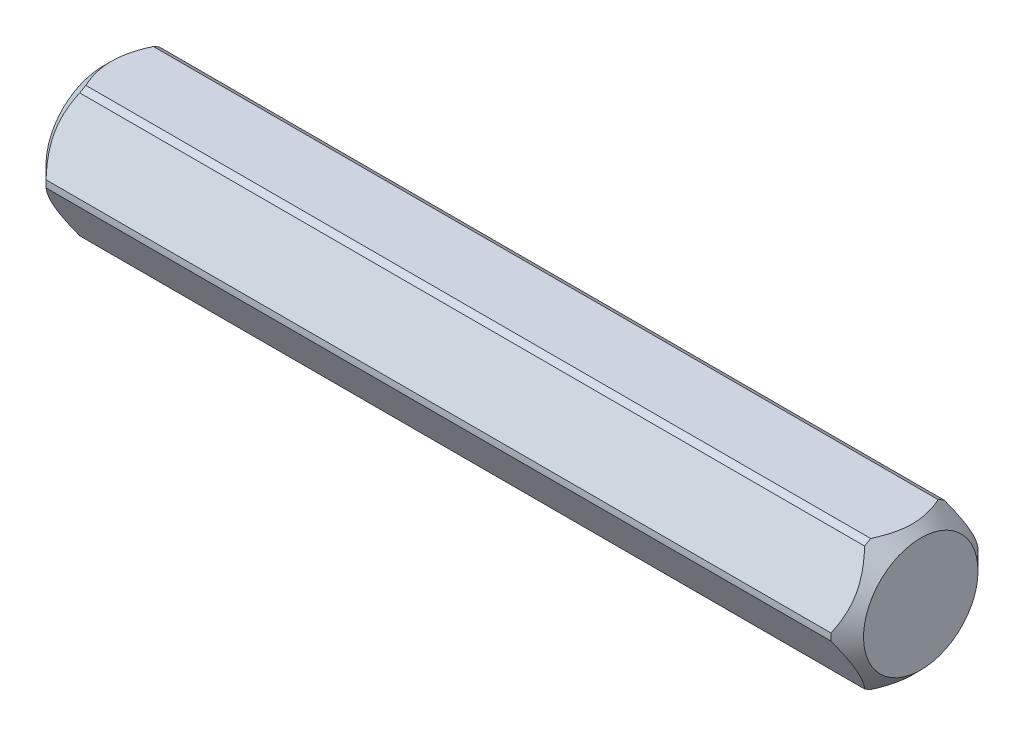
ISO-10303-21;
HEADER;
FILE_DESCRIPTION(('STEP AP214'),'2;1');
FILE_NAME('part.step','',(''),(''),'','','');
FILE_SCHEMA(('AUTOMOTIVE_DESIGN { 1 0 10303 214 1 1 1 1 }'));
ENDSEC;
DATA;
#1=APPLICATION_CONTEXT('core data for automotive mechanical design processes');
#2=APPLICATION_PROTOCOL_DEFINITION('international standard','automotive_design',2000,#1);
#3=PRODUCT_CONTEXT('',#1,'mechanical');
#4=PRODUCT('Part','Part','',(#3));
#5=PRODUCT_RELATED_PRODUCT_CATEGORY('part','',(#4));
#6=PRODUCT_DEFINITION_FORMATION('','',#4);
#7=PRODUCT_DEFINITION_CONTEXT('part definition',#1,'design');
#8=PRODUCT_DEFINITION('design','',#6,#7);
#9=PRODUCT_DEFINITION_SHAPE('','',#8);
#10=(LENGTH_UNIT() NAMED_UNIT(*) SI_UNIT(.MILLI.,.METRE.));
#11=(NAMED_UNIT(*) PLANE_ANGLE_UNIT() SI_UNIT($,.RADIAN.));
#12=(NAMED_UNIT(*) SI_UNIT($,.STERADIAN.) SOLID_ANGLE_UNIT());
#13=UNCERTAINTY_MEASURE_WITH_UNIT(LENGTH_MEASURE(1.E-05),#10,'distance_accuracy_value','');
#14=(GEOMETRIC_REPRESENTATION_CONTEXT(3) GLOBAL_UNCERTAINTY_ASSIGNED_CONTEXT((#13)) GLOBAL_UNIT_ASSIGNED_CONTEXT((#10,
#11,#12)) REPRESENTATION_CONTEXT('',''));
#15=CARTESIAN_POINT('',(0.,0.,0.));
#16=DIRECTION('',(0.,0.,1.));
#17=DIRECTION('',(1.,0.,0.));
#18=AXIS2_PLACEMENT_3D('',#15,#16,#17);
#19=CARTESIAN_POINT('',(-25.,0.,0.));
#20=DIRECTION('',(1.,0.,0.));
#21=DIRECTION('',(0.,0.,-1.));
#22=AXIS2_PLACEMENT_3D('',#19,#20,#21);
#23=CYLINDRICAL_SURFACE('',#22,4.5);
#24=CARTESIAN_POINT('',(-24.,0.,0.));
#25=DIRECTION('',(1.,0.,0.));
#26=DIRECTION('',(0.,0.,-1.));
#27=AXIS2_PLACEMENT_3D('',#24,#25,#26);
#28=CIRCLE('',#27,4.5);
#29=CARTESIAN_POINT('',(-24.,-3.99999999999999,-2.06155281280882));
#30=VERTEX_POINT('',#29);
#31=CARTESIAN_POINT('',(-24.,-3.7853571071357,-2.43332520873334));
#32=VERTEX_POINT('',#31);
#33=EDGE_CURVE('E440',#30,#32,#28,.T.);
#34=ORIENTED_EDGE('',*,*,#33,.T.);
#35=DIRECTION('',(1.,0.,0.));
#36=VECTOR('',#35,1.);
#37=CARTESIAN_POINT('',(-25.,-3.78535710713571,-2.43332520873334));
#38=LINE('',#37,#36);
#39=CARTESIAN_POINT('',(24.,-3.7853571071357,-2.43332520873334));
#40=VERTEX_POINT('',#39);
#41=EDGE_CURVE('E147',#32,#40,#38,.T.);
#42=ORIENTED_EDGE('',*,*,#41,.T.);
#43=CARTESIAN_POINT('',(24.,0.,0.));
#44=DIRECTION('',(1.,0.,0.));
#45=DIRECTION('',(0.,0.,-1.));
#46=AXIS2_PLACEMENT_3D('',#43,#44,#45);
#47=CIRCLE('',#46,4.5);
#48=CARTESIAN_POINT('',(24.,-3.99999999999999,-2.06155281280882));
#49=VERTEX_POINT('',#48);
#50=EDGE_CURVE('E129',#49,#40,#47,.T.);
#51=ORIENTED_EDGE('',*,*,#50,.F.);
#52=DIRECTION('',(1.,0.,0.));
#53=VECTOR('',#52,1.);
#54=CARTESIAN_POINT('',(-25.,-4.,-2.06155281280883));
#55=LINE('',#54,#53);
#56=EDGE_CURVE('E184',#49,#30,#55,.F.);
#57=ORIENTED_EDGE('',*,*,#56,.T.);
#58=EDGE_LOOP('',(#34,#42,#51,#57));
#59=FACE_BOUND('',#58,.T.);
#60=ADVANCED_FACE('F34',(#59),#23,.T.);
#61=CARTESIAN_POINT('',(-24.,-3.78535710713571,2.43332520873333));
#62=VERTEX_POINT('',#61);
#63=CARTESIAN_POINT('',(-24.,-4.,2.06155281280882));
#64=VERTEX_POINT('',#63);
#65=EDGE_CURVE('E441',#62,#64,#28,.T.);
#66=ORIENTED_EDGE('',*,*,#65,.T.);
#67=DIRECTION('',(1.,0.,0.));
#68=VECTOR('',#67,1.);
#69=CARTESIAN_POINT('',(-25.,-4.,2.06155281280882));
#70=LINE('',#69,#68);
#71=CARTESIAN_POINT('',(24.,-4.,2.06155281280882));
#72=VERTEX_POINT('',#71);
#73=EDGE_CURVE('E181',#64,#72,#70,.T.);
#74=ORIENTED_EDGE('',*,*,#73,.T.);
#75=CARTESIAN_POINT('',(24.,-3.78535710713571,2.43332520873333));
#76=VERTEX_POINT('',#75);
#77=EDGE_CURVE('E291',#76,#72,#47,.T.);
#78=ORIENTED_EDGE('',*,*,#77,.F.);
#79=DIRECTION('',(1.,0.,0.));
#80=VECTOR('',#79,1.);
#81=CARTESIAN_POINT('',(-25.,-3.78535710713572,2.43332520873334));
#82=LINE('',#81,#80);
#83=EDGE_CURVE('E178',#76,#62,#82,.F.);
#84=ORIENTED_EDGE('',*,*,#83,.T.);
#85=EDGE_LOOP('',(#66,#74,#78,#84));
#86=FACE_BOUND('',#85,.T.);
#87=ADVANCED_FACE('F313',(#86),#23,.T.);
#88=CARTESIAN_POINT('',(25.,-4.,2.3094010767585));
#89=DIRECTION('',(0.,1.,0.));
#90=DIRECTION('',(0.,0.,1.));
#91=AXIS2_PLACEMENT_3D('',#88,#89,#90);
#92=PLANE('',#91);
#93=ORIENTED_EDGE('',*,*,#73,.F.);
#94=CARTESIAN_POINT('',(-22.6928649035894,-4.,-4.20984774403587));
#95=CARTESIAN_POINT('',(-22.7683322571426,-4.,-4.10572300635099));
#96=CARTESIAN_POINT('',(-22.842955360482,-4.,-4.00097607923506));
#97=CARTESIAN_POINT('',(-22.9901526416945,-4.,-3.79001082425788));
#98=CARTESIAN_POINT('',(-23.0627262455371,-4.,-3.68379209634701));
#99=CARTESIAN_POINT('',(-23.2059640207921,-4.,-3.46890031935438));
#100=CARTESIAN_POINT('',(-23.2766094903172,-4.,-3.3602147530856));
#101=CARTESIAN_POINT('',(-23.4148896517596,-4.,-3.14095359873993));
#102=CARTESIAN_POINT('',(-23.482524567128,-4.,-3.03037815178072));
#103=CARTESIAN_POINT('',(-23.617180182585,-4.,-2.80193387204829));
#104=CARTESIAN_POINT('',(-23.6840300855366,-4.,-2.68396328072185));
#105=CARTESIAN_POINT('',(-23.8128070383945,-4.,-2.44537436143936));
#106=CARTESIAN_POINT('',(-23.8747334149841,-4.,-2.32475567421148));
#107=CARTESIAN_POINT('',(-24.0510992209669,-4.,-1.95915644375598));
#108=CARTESIAN_POINT('',(-24.1566367860336,-4.,-1.70959580749332));
#109=CARTESIAN_POINT('',(-24.2861804137903,-4.,-1.33029830953283));
#110=CARTESIAN_POINT('',(-24.3241322220595,-4.,-1.20530239351172));
#111=CARTESIAN_POINT('',(-24.3899388223468,-4.,-0.952617592005223));
#112=CARTESIAN_POINT('',(-24.4177928432461,-4.,-0.82492850164277));
#113=CARTESIAN_POINT('',(-24.4615756990499,-4.,-0.569582108969872));
#114=CARTESIAN_POINT('',(-24.4776869406595,-4.,-0.441956523226166));
#115=CARTESIAN_POINT('',(-24.4977250643249,-4.,-0.185747621111377));
#116=CARTESIAN_POINT('',(-24.5016533980343,-4.,-0.0571644206751577));
#117=CARTESIAN_POINT('',(-24.4971333329479,-4.,0.196534155188802));
#118=CARTESIAN_POINT('',(-24.4889943727592,-4.,0.321655254534303));
#119=CARTESIAN_POINT('',(-24.4613980492695,-4.,0.570635147563653));
#120=CARTESIAN_POINT('',(-24.4419394954324,-4.,0.694493807076179));
#121=CARTESIAN_POINT('',(-24.3923658437765,-4.,0.94214103598863));
#122=CARTESIAN_POINT('',(-24.3620813749865,-4.,1.06589520999821));
#123=CARTESIAN_POINT('',(-24.2923567428541,-4.,1.31074172841007));
#124=CARTESIAN_POINT('',(-24.2529177446344,-4.,1.43183440940288));
#125=CARTESIAN_POINT('',(-24.1588827297649,-4.,1.69187261628163));
#126=CARTESIAN_POINT('',(-24.1028455828701,-4.,1.83029292838178));
#127=CARTESIAN_POINT('',(-23.9823220956594,-4.,2.10343753165063));
#128=CARTESIAN_POINT('',(-23.9178315177234,-4.,2.23815992785214));
#129=CARTESIAN_POINT('',(-23.7819524607804,-4.,2.5046259823546));
#130=CARTESIAN_POINT('',(-23.7105414224703,-4.,2.63635804473518));
#131=CARTESIAN_POINT('',(-23.5624164043816,-4.,2.8967558561299));
#132=CARTESIAN_POINT('',(-23.4857033362368,-4.,3.02542212718707));
#133=CARTESIAN_POINT('',(-23.3320679810562,-4.,3.27361014613941));
#134=CARTESIAN_POINT('',(-23.2553567000029,-4.,3.39326320403362));
#135=CARTESIAN_POINT('',(-23.0988200514308,-4.,3.6305215763458));
#136=CARTESIAN_POINT('',(-23.0189944430863,-4.,3.74812673138176));
#137=CARTESIAN_POINT('',(-22.8574721996124,-4.,3.9805856203557));
#138=CARTESIAN_POINT('',(-22.7757967520329,-4.,4.09545412864817));
#139=CARTESIAN_POINT('',(-22.6103690712587,-4.,4.32363990413772));
#140=CARTESIAN_POINT('',(-22.5266174093983,-4.,4.4369575850589));
#141=CARTESIAN_POINT('',(-22.4420197526137,-4.,4.54962907034431));
#142=B_SPLINE_CURVE_WITH_KNOTS('',3,(#94,#95,#96,#97,#98,#99,#100,#101,#102,#103,#104,#105,#106,
#107,#108,#109,#110,#111,#112,#113,#114,#115,#116,#117,#118,#119,#120,#121,#122,#123,#124,#125,
#126,#127,#128,#129,#130,#131,#132,#133,#134,#135,#136,#137,#138,#139,#140,#141),.UNSPECIFIED.,
.F.,.F.,(4,2,2,2,2,2,2,2,2,2,2,2,2,2,2,2,2,2,2,2,2,2,2,4),(0.,0.385800042062576,
0.771707089606285,1.16054681927145,1.54935763997495,1.95602118677923,2.36274025152727,
3.17324409248812,3.56480527962874,3.95639636209754,4.34176689179921,4.72709150093877,
5.10270467711245,5.47835736547433,5.8601646545119,6.24192337648308,6.68956044955972,
7.13742278295022,7.5867975855516,8.036095313706,8.46243387400673,8.88880546795712,
9.31161701408834,9.734313474548),.UNSPECIFIED.);
#143=EDGE_CURVE('E212',#64,#30,#142,.F.);
#144=ORIENTED_EDGE('',*,*,#143,.T.);
#145=ORIENTED_EDGE('',*,*,#56,.F.);
#146=CARTESIAN_POINT('',(22.6928649035894,-4.,-4.20984774403588));
#147=CARTESIAN_POINT('',(22.7683322571427,-4.,-4.105723006351));
#148=CARTESIAN_POINT('',(22.842955360482,-4.,-4.00097607923507));
#149=CARTESIAN_POINT('',(22.9901526416945,-4.,-3.79001082425789));
#150=CARTESIAN_POINT('',(23.0627262455372,-4.,-3.68379209634702));
#151=CARTESIAN_POINT('',(23.2059640207921,-4.,-3.46890031935439));
#152=CARTESIAN_POINT('',(23.2766094903172,-4.,-3.36021475308561));
#153=CARTESIAN_POINT('',(23.4148896517596,-4.,-3.14095359873994));
#154=CARTESIAN_POINT('',(23.482524567128,-4.,-3.03037815178073));
#155=CARTESIAN_POINT('',(23.617180182585,-4.,-2.80193387204829));
#156=CARTESIAN_POINT('',(23.6840300855366,-4.,-2.68396328072186));
#157=CARTESIAN_POINT('',(23.8128070383945,-4.,-2.44537436143937));
#158=CARTESIAN_POINT('',(23.8747334149841,-4.,-2.32475567421148));
#159=CARTESIAN_POINT('',(24.0510992209669,-4.,-1.95915644375599));
#160=CARTESIAN_POINT('',(24.1566367860336,-4.,-1.70959580749332));
#161=CARTESIAN_POINT('',(24.2861804137904,-4.,-1.33029830953283));
#162=CARTESIAN_POINT('',(24.3241322220595,-4.,-1.20530239351172));
#163=CARTESIAN_POINT('',(24.3899388223468,-4.,-0.952617592005224));
#164=CARTESIAN_POINT('',(24.4177928432462,-4.,-0.82492850164277));
#165=CARTESIAN_POINT('',(24.4615756990499,-4.,-0.569582108969872));
#166=CARTESIAN_POINT('',(24.4776869406595,-4.,-0.441956523226166));
#167=CARTESIAN_POINT('',(24.4977250643249,-4.,-0.185747621111377));
#168=CARTESIAN_POINT('',(24.5016533980343,-4.,-0.057164420675157));
#169=CARTESIAN_POINT('',(24.4971333329479,-4.,0.196534155188803));
#170=CARTESIAN_POINT('',(24.4889943727592,-4.,0.321655254534304));
#171=CARTESIAN_POINT('',(24.4613980492696,-4.,0.570635147563655));
#172=CARTESIAN_POINT('',(24.4419394954324,-4.,0.694493807076181));
#173=CARTESIAN_POINT('',(24.3923658437765,-4.,0.942141035988633));
#174=CARTESIAN_POINT('',(24.3620813749865,-4.,1.06589520999821));
#175=CARTESIAN_POINT('',(24.2923567428542,-4.,1.31074172841007));
#176=CARTESIAN_POINT('',(24.2529177446344,-4.,1.43183440940289));
#177=CARTESIAN_POINT('',(24.1588827297649,-4.,1.69187261628163));
#178=CARTESIAN_POINT('',(24.1028455828701,-4.,1.83029292838179));
#179=CARTESIAN_POINT('',(23.9823220956594,-4.,2.10343753165063));
#180=CARTESIAN_POINT('',(23.9178315177234,-4.,2.23815992785214));
#181=CARTESIAN_POINT('',(23.7819524607804,-4.,2.50462598235461));
#182=CARTESIAN_POINT('',(23.7105414224704,-4.,2.63635804473519));
#183=CARTESIAN_POINT('',(23.5624164043816,-4.,2.89675585612991));
#184=CARTESIAN_POINT('',(23.4857033362368,-4.,3.02542212718708));
#185=CARTESIAN_POINT('',(23.3320679810562,-4.,3.27361014613942));
#186=CARTESIAN_POINT('',(23.2553567000029,-4.,3.39326320403363));
#187=CARTESIAN_POINT('',(23.0988200514308,-4.,3.63052157634581));
#188=CARTESIAN_POINT('',(23.0189944430863,-4.,3.74812673138178));
#189=CARTESIAN_POINT('',(22.8574721996124,-4.,3.98058562035571));
#190=CARTESIAN_POINT('',(22.7757967520329,-4.,4.09545412864819));
#191=CARTESIAN_POINT('',(22.6103690712587,-4.,4.32363990413774));
#192=CARTESIAN_POINT('',(22.5266174093983,-4.,4.43695758505892));
#193=CARTESIAN_POINT('',(22.4420197526137,-4.,4.54962907034433));
#194=B_SPLINE_CURVE_WITH_KNOTS('',3,(#146,#147,#148,#149,#150,#151,#152,#153,#154,#155,#156,
#157,#158,#159,#160,#161,#162,#163,#164,#165,#166,#167,#168,#169,#170,#171,#172,#173,#174,#175,
#176,#177,#178,#179,#180,#181,#182,#183,#184,#185,#186,#187,#188,#189,#190,#191,#192,#193),
.UNSPECIFIED.,.F.,.F.,(4,2,2,2,2,2,2,2,2,2,2,2,2,2,2,2,2,2,2,2,2,2,2,4),(0.,0.385800042062574,
0.771707089606282,1.16054681927145,1.54935763997495,1.95602118677923,2.36274025152728,
3.17324409248813,3.56480527962875,3.95639636209755,4.34176689179922,4.72709150093878,
5.10270467711246,5.47835736547434,5.86016465451192,6.2419233764831,6.68956044955974,
7.13742278295024,7.58679758555162,8.03609531370602,8.46243387400676,8.88880546795715,
9.31161701408837,9.73431347454803),.UNSPECIFIED.);
#195=EDGE_CURVE('E297',#49,#72,#194,.T.);
#196=ORIENTED_EDGE('',*,*,#195,.T.);
#197=EDGE_LOOP('',(#93,#144,#145,#196));
#198=FACE_BOUND('',#197,.T.);
#199=ADVANCED_FACE('F309',(#198),#92,.F.);
#200=CARTESIAN_POINT('',(-24.,0.214642892864282,4.49487802154217));
#201=VERTEX_POINT('',#200);
#202=CARTESIAN_POINT('',(-24.,-0.214642892864288,4.49487802154217));
#203=VERTEX_POINT('',#202);
#204=EDGE_CURVE('E288',#201,#203,#28,.T.);
#205=ORIENTED_EDGE('',*,*,#204,.T.);
#206=DIRECTION('',(1.,0.,0.));
#207=VECTOR('',#206,1.);
#208=CARTESIAN_POINT('',(-25.,-0.214642892864287,4.49487802154217));
#209=LINE('',#208,#207);
#210=CARTESIAN_POINT('',(24.,-0.214642892864288,4.49487802154217));
#211=VERTEX_POINT('',#210);
#212=EDGE_CURVE('E175',#203,#211,#209,.T.);
#213=ORIENTED_EDGE('',*,*,#212,.T.);
#214=CARTESIAN_POINT('',(24.,0.214642892864282,4.49487802154217));
#215=VERTEX_POINT('',#214);
#216=EDGE_CURVE('E289',#215,#211,#47,.T.);
#217=ORIENTED_EDGE('',*,*,#216,.F.);
#218=DIRECTION('',(1.,0.,0.));
#219=VECTOR('',#218,1.);
#220=CARTESIAN_POINT('',(-25.,0.214642892864283,4.49487802154217));
#221=LINE('',#220,#219);
#222=EDGE_CURVE('E172',#215,#201,#221,.F.);
#223=ORIENTED_EDGE('',*,*,#222,.T.);
#224=EDGE_LOOP('',(#205,#213,#217,#223));
#225=FACE_BOUND('',#224,.T.);
#226=ADVANCED_FACE('F287',(#225),#23,.T.);
#227=CARTESIAN_POINT('',(25.,0.,4.618802153517));
#228=DIRECTION('',(0.,0.5,-0.866025403784438));
#229=DIRECTION('',(0.,0.866025403784439,0.5));
#230=AXIS2_PLACEMENT_3D('',#227,#228,#229);
#231=PLANE('',#230);
#232=ORIENTED_EDGE('',*,*,#212,.F.);
#233=CARTESIAN_POINT('',(-23.9998941963782,-0.214442892864289,4.49499349159601));
#234=CARTESIAN_POINT('',(-24.0664192825533,-0.340235442402056,4.42236712925833));
#235=CARTESIAN_POINT('',(-24.1284859139684,-0.468005378985892,4.34859912197731));
#236=CARTESIAN_POINT('',(-24.2410974501275,-0.727878171317941,4.19856149536934));
#237=CARTESIAN_POINT('',(-24.2915930288924,-0.859996928098182,4.12228269557727));
#238=CARTESIAN_POINT('',(-24.3772964035166,-1.12616188041506,3.96861228870828));
#239=CARTESIAN_POINT('',(-24.412692978064,-1.26016123783863,3.89124772362854));
#240=CARTESIAN_POINT('',(-24.4663535308738,-1.53053549616594,3.73514707280132));
#241=CARTESIAN_POINT('',(-24.4846469548417,-1.66690590097512,3.65641358287524));
#242=CARTESIAN_POINT('',(-24.5018229694782,-1.92984243616877,3.5046071035014));
#243=CARTESIAN_POINT('',(-24.5021148581694,-2.05633906156165,3.43157424277924));
#244=CARTESIAN_POINT('',(-24.4867907591089,-2.30866082335366,3.28589620568623));
#245=CARTESIAN_POINT('',(-24.4711663583711,-2.43448556925573,3.21325125476895));
#246=CARTESIAN_POINT('',(-24.4252415067076,-2.68406443764097,3.06915682792269));
#247=CARTESIAN_POINT('',(-24.3949407378895,-2.80781851521306,2.99770737792313));
#248=CARTESIAN_POINT('',(-24.3216820791155,-3.05249145481317,2.85644539038159));
#249=CARTESIAN_POINT('',(-24.2787190677523,-3.17340914822362,2.78663352754128));
#250=CARTESIAN_POINT('',(-24.1967021799686,-3.3765763870683,2.66933486750379));
#251=CARTESIAN_POINT('',(-24.160279052702,-3.459641216358,2.62137736595319));
#252=CARTESIAN_POINT('',(-24.0831422190421,-3.62390438606655,2.52653998070401));
#253=CARTESIAN_POINT('',(-24.0424451392451,-3.70510856445355,2.47965672645296));
#254=CARTESIAN_POINT('',(-23.9998941963782,-3.78555710713571,2.4332097386795));
#255=B_SPLINE_CURVE_WITH_KNOTS('',3,(#233,#234,#235,#236,#237,#238,#239,#240,#241,#242,#243,
#244,#245,#246,#247,#248,#249,#250,#251,#252,#253,#254),.UNSPECIFIED.,.F.,.F.,(4,2,2,2,2,2,2,2,
2,2,4),(0.,0.479542803803611,0.961093310814039,1.43643287483049,1.91095255343955,
2.34827188801426,2.78582249958598,3.22338258899905,3.66111989867402,3.96880795536116,
4.27534051498786),.UNSPECIFIED.);
#256=EDGE_CURVE('E222',#203,#62,#255,.T.);
#257=ORIENTED_EDGE('',*,*,#256,.T.);
#258=ORIENTED_EDGE('',*,*,#83,.F.);
#259=CARTESIAN_POINT('',(23.9998941963782,-3.78555710713571,2.4332097386795));
#260=CARTESIAN_POINT('',(24.0664192825533,-3.65976455759794,2.50583610101718));
#261=CARTESIAN_POINT('',(24.1284859139684,-3.53199462101411,2.5796041082982));
#262=CARTESIAN_POINT('',(24.2410974501275,-3.27212182868206,2.72964173490617));
#263=CARTESIAN_POINT('',(24.2915930288924,-3.14000307190182,2.80592053469824));
#264=CARTESIAN_POINT('',(24.3772964035166,-2.87383811958494,2.95959094156723));
#265=CARTESIAN_POINT('',(24.412692978064,-2.73983876216137,3.03695550664697));
#266=CARTESIAN_POINT('',(24.4663535308738,-2.46946450383406,3.19305615747419));
#267=CARTESIAN_POINT('',(24.4846469548417,-2.33309409902487,3.27178964740027));
#268=CARTESIAN_POINT('',(24.5018229694783,-2.07015756383122,3.42359612677411));
#269=CARTESIAN_POINT('',(24.5021148581694,-1.94366093843834,3.49662898749627));
#270=CARTESIAN_POINT('',(24.4867907591089,-1.69133917664633,3.64230702458928));
#271=CARTESIAN_POINT('',(24.4711663583711,-1.56551443074426,3.71495197550656));
#272=CARTESIAN_POINT('',(24.4252415067076,-1.31593556235902,3.85904640235282));
#273=CARTESIAN_POINT('',(24.3949407378895,-1.19218148478693,3.93049585235238));
#274=CARTESIAN_POINT('',(24.3216820791155,-0.947508545186819,4.07175783989393));
#275=CARTESIAN_POINT('',(24.2787190677524,-0.826590851776376,4.14156970273423));
#276=CARTESIAN_POINT('',(24.1967021799686,-0.623423612931689,4.25886836277173));
#277=CARTESIAN_POINT('',(24.160279052702,-0.540358783641999,4.30682586432232));
#278=CARTESIAN_POINT('',(24.0831422190421,-0.376095613933444,4.40166324957149));
#279=CARTESIAN_POINT('',(24.0424451392451,-0.294891435546448,4.44854650382255));
#280=CARTESIAN_POINT('',(23.9998941963782,-0.214442892864288,4.49499349159601));
#281=B_SPLINE_CURVE_WITH_KNOTS('',3,(#259,#260,#261,#262,#263,#264,#265,#266,#267,#268,#269,
#270,#271,#272,#273,#274,#275,#276,#277,#278,#279,#280),.UNSPECIFIED.,.F.,.F.,(4,2,2,2,2,2,2,2,
2,2,4),(0.,0.479542803803614,0.961093310814044,1.4364328748305,1.91095255343956,
2.34827188801427,2.78582249958599,3.22338258899906,3.66111989867404,3.96880795536116,
4.27534051498786),.UNSPECIFIED.);
#282=EDGE_CURVE('E304',#76,#211,#281,.T.);
#283=ORIENTED_EDGE('',*,*,#282,.T.);
#284=EDGE_LOOP('',(#232,#257,#258,#283));
#285=FACE_BOUND('',#284,.T.);
#286=ADVANCED_FACE('F315',(#285),#231,.F.);
#287=CARTESIAN_POINT('',(-24.,4.,2.06155281280883));
#288=VERTEX_POINT('',#287);
#289=CARTESIAN_POINT('',(-24.,3.78535710713571,2.43332520873334));
#290=VERTEX_POINT('',#289);
#291=EDGE_CURVE('E298',#288,#290,#28,.T.);
#292=ORIENTED_EDGE('',*,*,#291,.T.);
#293=DIRECTION('',(1.,0.,0.));
#294=VECTOR('',#293,1.);
#295=CARTESIAN_POINT('',(-25.,3.78535710713571,2.43332520873334));
#296=LINE('',#295,#294);
#297=CARTESIAN_POINT('',(24.,3.78535710713571,2.43332520873334));
#298=VERTEX_POINT('',#297);
#299=EDGE_CURVE('E167',#290,#298,#296,.T.);
#300=ORIENTED_EDGE('',*,*,#299,.T.);
#301=CARTESIAN_POINT('',(24.,4.,2.06155281280883));
#302=VERTEX_POINT('',#301);
#303=EDGE_CURVE('E131',#302,#298,#47,.T.);
#304=ORIENTED_EDGE('',*,*,#303,.F.);
#305=DIRECTION('',(1.,0.,0.));
#306=VECTOR('',#305,1.);
#307=CARTESIAN_POINT('',(-25.,4.,2.06155281280883));
#308=LINE('',#307,#306);
#309=EDGE_CURVE('E163',#302,#288,#308,.F.);
#310=ORIENTED_EDGE('',*,*,#309,.T.);
#311=EDGE_LOOP('',(#292,#300,#304,#310));
#312=FACE_BOUND('',#311,.T.);
#313=ADVANCED_FACE('F319',(#312),#23,.T.);
#314=CARTESIAN_POINT('',(25.,4.,2.3094010767585));
#315=DIRECTION('',(0.,-0.499999999999999,-0.866025403784439));
#316=DIRECTION('',(0.,0.866025403784439,-0.499999999999999));
#317=AXIS2_PLACEMENT_3D('',#314,#315,#316);
#318=PLANE('',#317);
#319=ORIENTED_EDGE('',*,*,#299,.F.);
#320=CARTESIAN_POINT('',(-23.9998941963782,3.78555710713571,2.4332097386795));
#321=CARTESIAN_POINT('',(-24.0664192825533,3.65976455759794,2.50583610101718));
#322=CARTESIAN_POINT('',(-24.1284859139684,3.53199462101411,2.5796041082982));
#323=CARTESIAN_POINT('',(-24.2410974501275,3.27212182868206,2.72964173490617));
#324=CARTESIAN_POINT('',(-24.2915930288924,3.14000307190182,2.80592053469824));
#325=CARTESIAN_POINT('',(-24.3772964035166,2.87383811958494,2.95959094156723));
#326=CARTESIAN_POINT('',(-24.412692978064,2.73983876216137,3.03695550664697));
#327=CARTESIAN_POINT('',(-24.4663535308738,2.46946450383406,3.19305615747419));
#328=CARTESIAN_POINT('',(-24.4846469548417,2.33309409902488,3.27178964740027));
#329=CARTESIAN_POINT('',(-24.5018229694782,2.07015756383123,3.42359612677411));
#330=CARTESIAN_POINT('',(-24.5021148581694,1.94366093843834,3.49662898749627));
#331=CARTESIAN_POINT('',(-24.4867907591089,1.69133917664634,3.64230702458928));
#332=CARTESIAN_POINT('',(-24.4711663583711,1.56551443074427,3.71495197550656));
#333=CARTESIAN_POINT('',(-24.4252415067076,1.31593556235903,3.85904640235282));
#334=CARTESIAN_POINT('',(-24.3949407378895,1.19218148478694,3.93049585235238));
#335=CARTESIAN_POINT('',(-24.3216820791155,0.947508545186824,4.07175783989392));
#336=CARTESIAN_POINT('',(-24.2787190677524,0.826590851776383,4.14156970273423));
#337=CARTESIAN_POINT('',(-24.1967021799686,0.623423612931694,4.25886836277172));
#338=CARTESIAN_POINT('',(-24.160279052702,0.540358783642001,4.30682586432231));
#339=CARTESIAN_POINT('',(-24.0831422190421,0.376095613933442,4.40166324957149));
#340=CARTESIAN_POINT('',(-24.0424451392451,0.294891435546444,4.44854650382255));
#341=CARTESIAN_POINT('',(-23.9998941963782,0.214442892864283,4.49499349159601));
#342=B_SPLINE_CURVE_WITH_KNOTS('',3,(#320,#321,#322,#323,#324,#325,#326,#327,#328,#329,#330,
#331,#332,#333,#334,#335,#336,#337,#338,#339,#340,#341),.UNSPECIFIED.,.F.,.F.,(4,2,2,2,2,2,2,2,
2,2,4),(0.,0.479542803803611,0.961093310814039,1.43643287483049,1.91095255343955,
2.34827188801426,2.78582249958598,3.22338258899905,3.66111989867402,3.96880795536116,
4.27534051498786),.UNSPECIFIED.);
#343=EDGE_CURVE('E230',#290,#201,#342,.T.);
#344=ORIENTED_EDGE('',*,*,#343,.T.);
#345=ORIENTED_EDGE('',*,*,#222,.F.);
#346=CARTESIAN_POINT('',(23.9998941963782,0.214442892864283,4.49499349159601));
#347=CARTESIAN_POINT('',(24.0664192825533,0.340235442402051,4.42236712925833));
#348=CARTESIAN_POINT('',(24.1284859139684,0.468005378985888,4.34859912197731));
#349=CARTESIAN_POINT('',(24.2410974501276,0.727878171317938,4.19856149536934));
#350=CARTESIAN_POINT('',(24.2915930288924,0.859996928098178,4.12228269557727));
#351=CARTESIAN_POINT('',(24.3772964035166,1.12616188041506,3.96861228870828));
#352=CARTESIAN_POINT('',(24.4126929780641,1.26016123783863,3.89124772362854));
#353=CARTESIAN_POINT('',(24.4663535308738,1.53053549616594,3.73514707280132));
#354=CARTESIAN_POINT('',(24.4846469548417,1.66690590097513,3.65641358287524));
#355=CARTESIAN_POINT('',(24.5018229694783,1.92984243616878,3.5046071035014));
#356=CARTESIAN_POINT('',(24.5021148581694,2.05633906156166,3.43157424277924));
#357=CARTESIAN_POINT('',(24.486790759109,2.30866082335366,3.28589620568622));
#358=CARTESIAN_POINT('',(24.4711663583711,2.43448556925574,3.21325125476895));
#359=CARTESIAN_POINT('',(24.4252415067076,2.68406443764098,3.06915682792269));
#360=CARTESIAN_POINT('',(24.3949407378895,2.80781851521307,2.99770737792313));
#361=CARTESIAN_POINT('',(24.3216820791155,3.05249145481318,2.85644539038158));
#362=CARTESIAN_POINT('',(24.2787190677524,3.17340914822362,2.78663352754128));
#363=CARTESIAN_POINT('',(24.1967021799686,3.37657638706831,2.66933486750378));
#364=CARTESIAN_POINT('',(24.160279052702,3.459641216358,2.62137736595319));
#365=CARTESIAN_POINT('',(24.0831422190421,3.62390438606655,2.52653998070402));
#366=CARTESIAN_POINT('',(24.0424451392451,3.70510856445355,2.47965672645296));
#367=CARTESIAN_POINT('',(23.9998941963782,3.78555710713571,2.4332097386795));
#368=B_SPLINE_CURVE_WITH_KNOTS('',3,(#346,#347,#348,#349,#350,#351,#352,#353,#354,#355,#356,
#357,#358,#359,#360,#361,#362,#363,#364,#365,#366,#367),.UNSPECIFIED.,.F.,.F.,(4,2,2,2,2,2,2,2,
2,2,4),(0.,0.479542803803613,0.961093310814043,1.4364328748305,1.91095255343956,
2.34827188801427,2.78582249958599,3.22338258899906,3.66111989867404,3.96880795536116,
4.27534051498786),.UNSPECIFIED.);
#369=EDGE_CURVE('E164',#215,#298,#368,.T.);
#370=ORIENTED_EDGE('',*,*,#369,.T.);
#371=EDGE_LOOP('',(#319,#344,#345,#370));
#372=FACE_BOUND('',#371,.T.);
#373=ADVANCED_FACE('F243',(#372),#318,.F.);
#374=CARTESIAN_POINT('',(-24.,0.,0.));
#375=DIRECTION('',(1.,0.,0.));
#376=DIRECTION('',(0.,0.,-1.));
#377=AXIS2_PLACEMENT_3D('',#374,#375,#376);
#378=CIRCLE('',#377,4.5);
#379=CARTESIAN_POINT('',(-24.,4.,-2.06155281280883));
#380=VERTEX_POINT('',#379);
#381=CARTESIAN_POINT('',(-24.,3.78535710713571,-2.43332520873334));
#382=VERTEX_POINT('',#381);
#383=EDGE_CURVE('E11',#380,#382,#378,.F.);
#384=ORIENTED_EDGE('',*,*,#383,.F.);
#385=DIRECTION('',(1.,0.,0.));
#386=VECTOR('',#385,1.);
#387=CARTESIAN_POINT('',(-25.,4.,-2.06155281280883));
#388=LINE('',#387,#386);
#389=CARTESIAN_POINT('',(24.,4.,-2.06155281280883));
#390=VERTEX_POINT('',#389);
#391=EDGE_CURVE('E149',#380,#390,#388,.T.);
#392=ORIENTED_EDGE('',*,*,#391,.T.);
#393=CARTESIAN_POINT('',(24.,0.,0.));
#394=DIRECTION('',(-1.,0.,0.));
#395=DIRECTION('',(0.,0.,1.));
#396=AXIS2_PLACEMENT_3D('',#393,#394,#395);
#397=CIRCLE('',#396,4.5);
#398=CARTESIAN_POINT('',(24.,3.78535710713571,-2.43332520873334));
#399=VERTEX_POINT('',#398);
#400=EDGE_CURVE('E43',#399,#390,#397,.F.);
#401=ORIENTED_EDGE('',*,*,#400,.F.);
#402=DIRECTION('',(1.,0.,0.));
#403=VECTOR('',#402,1.);
#404=CARTESIAN_POINT('',(-25.,3.78535710713571,-2.43332520873334));
#405=LINE('',#404,#403);
#406=EDGE_CURVE('E139',#399,#382,#405,.F.);
#407=ORIENTED_EDGE('',*,*,#406,.T.);
#408=EDGE_LOOP('',(#384,#392,#401,#407));
#409=FACE_BOUND('',#408,.T.);
#410=ADVANCED_FACE('F166',(#409),#23,.T.);
#411=CARTESIAN_POINT('',(25.,4.,-2.3094010767585));
#412=DIRECTION('',(0.,-1.,0.));
#413=DIRECTION('',(0.,0.,-1.));
#414=AXIS2_PLACEMENT_3D('',#411,#412,#413);
#415=PLANE('',#414);
#416=ORIENTED_EDGE('',*,*,#391,.F.);
#417=CARTESIAN_POINT('',(-22.6928649035894,4.,-4.20984774403589));
#418=CARTESIAN_POINT('',(-22.7683322571426,4.,-4.105723006351));
#419=CARTESIAN_POINT('',(-22.842955360482,4.,-4.00097607923508));
#420=CARTESIAN_POINT('',(-22.9901526416945,4.,-3.79001082425789));
#421=CARTESIAN_POINT('',(-23.0627262455371,4.,-3.68379209634702));
#422=CARTESIAN_POINT('',(-23.2059640207921,4.,-3.46890031935439));
#423=CARTESIAN_POINT('',(-23.2766094903172,4.,-3.36021475308561));
#424=CARTESIAN_POINT('',(-23.4148896517596,4.,-3.14095359873994));
#425=CARTESIAN_POINT('',(-23.482524567128,4.,-3.03037815178073));
#426=CARTESIAN_POINT('',(-23.617180182585,4.,-2.8019338720483));
#427=CARTESIAN_POINT('',(-23.6840300855366,4.,-2.68396328072186));
#428=CARTESIAN_POINT('',(-23.8128070383945,4.,-2.44537436143937));
#429=CARTESIAN_POINT('',(-23.8747334149841,4.,-2.32475567421148));
#430=CARTESIAN_POINT('',(-24.0510992209669,4.,-1.95915644375599));
#431=CARTESIAN_POINT('',(-24.1566367860336,4.,-1.70959580749333));
#432=CARTESIAN_POINT('',(-24.2861804137904,4.,-1.33029830953283));
#433=CARTESIAN_POINT('',(-24.3241322220595,4.,-1.20530239351173));
#434=CARTESIAN_POINT('',(-24.3899388223468,4.,-0.952617592005226));
#435=CARTESIAN_POINT('',(-24.4177928432462,4.,-0.824928501642774));
#436=CARTESIAN_POINT('',(-24.4615756990499,4.,-0.569582108969876));
#437=CARTESIAN_POINT('',(-24.4776869406595,4.,-0.44195652322617));
#438=CARTESIAN_POINT('',(-24.4977250643249,4.,-0.185747621111382));
#439=CARTESIAN_POINT('',(-24.5016533980343,4.,-0.0571644206751632));
#440=CARTESIAN_POINT('',(-24.4971333329479,4.,0.196534155188796));
#441=CARTESIAN_POINT('',(-24.4889943727592,4.,0.321655254534297));
#442=CARTESIAN_POINT('',(-24.4613980492696,4.,0.570635147563647));
#443=CARTESIAN_POINT('',(-24.4419394954324,4.,0.694493807076172));
#444=CARTESIAN_POINT('',(-24.3923658437765,4.,0.942141035988623));
#445=CARTESIAN_POINT('',(-24.3620813749865,4.,1.0658952099982));
#446=CARTESIAN_POINT('',(-24.2923567428542,4.,1.31074172841006));
#447=CARTESIAN_POINT('',(-24.2529177446344,4.,1.43183440940287));
#448=CARTESIAN_POINT('',(-24.1588827297649,4.,1.69187261628162));
#449=CARTESIAN_POINT('',(-24.1028455828701,4.,1.83029292838177));
#450=CARTESIAN_POINT('',(-23.9823220956594,4.,2.10343753165062));
#451=CARTESIAN_POINT('',(-23.9178315177234,4.,2.23815992785212));
#452=CARTESIAN_POINT('',(-23.7819524607804,4.,2.50462598235459));
#453=CARTESIAN_POINT('',(-23.7105414224704,4.,2.63635804473517));
#454=CARTESIAN_POINT('',(-23.5624164043816,4.,2.89675585612988));
#455=CARTESIAN_POINT('',(-23.4857033362368,4.,3.02542212718705));
#456=CARTESIAN_POINT('',(-23.3320679810562,4.,3.27361014613939));
#457=CARTESIAN_POINT('',(-23.2553567000029,4.,3.3932632040336));
#458=CARTESIAN_POINT('',(-23.0988200514308,4.,3.63052157634578));
#459=CARTESIAN_POINT('',(-23.0189944430863,4.,3.74812673138174));
#460=CARTESIAN_POINT('',(-22.8574721996124,4.,3.98058562035568));
#461=CARTESIAN_POINT('',(-22.7757967520329,4.,4.09545412864815));
#462=CARTESIAN_POINT('',(-22.6103690712587,4.,4.3236399041377));
#463=CARTESIAN_POINT('',(-22.5266174093984,4.,4.43695758505888));
#464=CARTESIAN_POINT('',(-22.4420197526138,4.,4.54962907034429));
#465=B_SPLINE_CURVE_WITH_KNOTS('',3,(#417,#418,#419,#420,#421,#422,#423,#424,#425,#426,#427,
#428,#429,#430,#431,#432,#433,#434,#435,#436,#437,#438,#439,#440,#441,#442,#443,#444,#445,#446,
#447,#448,#449,#450,#451,#452,#453,#454,#455,#456,#457,#458,#459,#460,#461,#462,#463,#464),
.UNSPECIFIED.,.F.,.F.,(4,2,2,2,2,2,2,2,2,2,2,2,2,2,2,2,2,2,2,2,2,2,2,4),(0.,0.385800042062577,
0.771707089606284,1.16054681927146,1.54935763997496,1.95602118677923,2.36274025152728,
3.17324409248814,3.56480527962875,3.95639636209756,4.34176689179922,4.72709150093878,
5.10270467711246,5.47835736547434,5.86016465451191,6.24192337648309,6.68956044955973,
7.13742278295023,7.5867975855516,8.036095313706,8.46243387400673,8.88880546795712,
9.31161701408833,9.73431347454799),.UNSPECIFIED.);
#466=EDGE_CURVE('E49',#380,#288,#465,.T.);
#467=ORIENTED_EDGE('',*,*,#466,.T.);
#468=ORIENTED_EDGE('',*,*,#309,.F.);
#469=CARTESIAN_POINT('',(22.6928649035894,4.,-4.2098477440359));
#470=CARTESIAN_POINT('',(22.7683322571427,4.,-4.10572300635101));
#471=CARTESIAN_POINT('',(22.842955360482,4.,-4.00097607923509));
#472=CARTESIAN_POINT('',(22.9901526416945,4.,-3.7900108242579));
#473=CARTESIAN_POINT('',(23.0627262455372,4.,-3.68379209634703));
#474=CARTESIAN_POINT('',(23.2059640207921,4.,-3.4689003193544));
#475=CARTESIAN_POINT('',(23.2766094903172,4.,-3.36021475308562));
#476=CARTESIAN_POINT('',(23.4148896517596,4.,-3.14095359873995));
#477=CARTESIAN_POINT('',(23.482524567128,4.,-3.03037815178074));
#478=CARTESIAN_POINT('',(23.617180182585,4.,-2.80193387204831));
#479=CARTESIAN_POINT('',(23.6840300855366,4.,-2.68396328072187));
#480=CARTESIAN_POINT('',(23.8128070383945,4.,-2.44537436143938));
#481=CARTESIAN_POINT('',(23.8747334149841,4.,-2.32475567421149));
#482=CARTESIAN_POINT('',(24.0510992209669,4.,-1.95915644375599));
#483=CARTESIAN_POINT('',(24.1566367860336,4.,-1.70959580749333));
#484=CARTESIAN_POINT('',(24.2861804137904,4.,-1.33029830953283));
#485=CARTESIAN_POINT('',(24.3241322220595,4.,-1.20530239351173));
#486=CARTESIAN_POINT('',(24.3899388223468,4.,-0.952617592005227));
#487=CARTESIAN_POINT('',(24.4177928432462,4.,-0.824928501642774));
#488=CARTESIAN_POINT('',(24.4615756990499,4.,-0.569582108969877));
#489=CARTESIAN_POINT('',(24.4776869406595,4.,-0.44195652322617));
#490=CARTESIAN_POINT('',(24.4977250643249,4.,-0.185747621111381));
#491=CARTESIAN_POINT('',(24.5016533980343,4.,-0.0571644206751611));
#492=CARTESIAN_POINT('',(24.4971333329479,4.,0.1965341551888));
#493=CARTESIAN_POINT('',(24.4889943727593,4.,0.321655254534301));
#494=CARTESIAN_POINT('',(24.4613980492696,4.,0.570635147563651));
#495=CARTESIAN_POINT('',(24.4419394954324,4.,0.694493807076177));
#496=CARTESIAN_POINT('',(24.3923658437765,4.,0.942141035988629));
#497=CARTESIAN_POINT('',(24.3620813749865,4.,1.06589520999821));
#498=CARTESIAN_POINT('',(24.2923567428542,4.,1.31074172841007));
#499=CARTESIAN_POINT('',(24.2529177446344,4.,1.43183440940288));
#500=CARTESIAN_POINT('',(24.1588827297649,4.,1.69187261628163));
#501=CARTESIAN_POINT('',(24.1028455828701,4.,1.83029292838178));
#502=CARTESIAN_POINT('',(23.9823220956594,4.,2.10343753165063));
#503=CARTESIAN_POINT('',(23.9178315177235,4.,2.23815992785214));
#504=CARTESIAN_POINT('',(23.7819524607804,4.,2.50462598235461));
#505=CARTESIAN_POINT('',(23.7105414224704,4.,2.63635804473519));
#506=CARTESIAN_POINT('',(23.5624164043816,4.,2.8967558561299));
#507=CARTESIAN_POINT('',(23.4857033362368,4.,3.02542212718707));
#508=CARTESIAN_POINT('',(23.3320679810562,4.,3.27361014613941));
#509=CARTESIAN_POINT('',(23.2553567000029,4.,3.39326320403362));
#510=CARTESIAN_POINT('',(23.0988200514308,4.,3.6305215763458));
#511=CARTESIAN_POINT('',(23.0189944430863,4.,3.74812673138176));
#512=CARTESIAN_POINT('',(22.8574721996124,4.,3.9805856203557));
#513=CARTESIAN_POINT('',(22.7757967520329,4.,4.09545412864817));
#514=CARTESIAN_POINT('',(22.6103690712587,4.,4.32363990413772));
#515=CARTESIAN_POINT('',(22.5266174093984,4.,4.4369575850589));
#516=CARTESIAN_POINT('',(22.4420197526138,4.,4.54962907034432));
#517=B_SPLINE_CURVE_WITH_KNOTS('',3,(#469,#470,#471,#472,#473,#474,#475,#476,#477,#478,#479,
#480,#481,#482,#483,#484,#485,#486,#487,#488,#489,#490,#491,#492,#493,#494,#495,#496,#497,#498,
#499,#500,#501,#502,#503,#504,#505,#506,#507,#508,#509,#510,#511,#512,#513,#514,#515,#516),
.UNSPECIFIED.,.F.,.F.,(4,2,2,2,2,2,2,2,2,2,2,2,2,2,2,2,2,2,2,2,2,2,2,4),(0.,0.385800042062577,
0.771707089606285,1.16054681927145,1.54935763997496,1.95602118677923,2.36274025152729,
3.17324409248814,3.56480527962876,3.95639636209757,4.34176689179923,4.7270915009388,
5.10270467711247,5.47835736547435,5.86016465451193,6.24192337648311,6.68956044955975,
7.13742278295025,7.58679758555163,8.03609531370603,8.46243387400676,8.88880546795715,
9.31161701408836,9.73431347454803),.UNSPECIFIED.);
#518=EDGE_CURVE('E140',#302,#390,#517,.F.);
#519=ORIENTED_EDGE('',*,*,#518,.T.);
#520=EDGE_LOOP('',(#416,#467,#468,#519));
#521=FACE_BOUND('',#520,.T.);
#522=ADVANCED_FACE('F161',(#521),#415,.F.);
#523=CARTESIAN_POINT('',(-24.,-0.214642892864286,-4.49487802154217));
#524=VERTEX_POINT('',#523);
#525=CARTESIAN_POINT('',(-24.,0.214642892864287,-4.49487802154217));
#526=VERTEX_POINT('',#525);
#527=EDGE_CURVE('E144',#524,#526,#28,.T.);
#528=ORIENTED_EDGE('',*,*,#527,.T.);
#529=DIRECTION('',(1.,0.,0.));
#530=VECTOR('',#529,1.);
#531=CARTESIAN_POINT('',(-25.,0.214642892864287,-4.49487802154217));
#532=LINE('',#531,#530);
#533=CARTESIAN_POINT('',(24.,0.214642892864287,-4.49487802154217));
#534=VERTEX_POINT('',#533);
#535=EDGE_CURVE('E137',#526,#534,#532,.T.);
#536=ORIENTED_EDGE('',*,*,#535,.T.);
#537=CARTESIAN_POINT('',(24.,-0.214642892864286,-4.49487802154217));
#538=VERTEX_POINT('',#537);
#539=EDGE_CURVE('E121',#538,#534,#47,.T.);
#540=ORIENTED_EDGE('',*,*,#539,.F.);
#541=DIRECTION('',(1.,0.,0.));
#542=VECTOR('',#541,1.);
#543=CARTESIAN_POINT('',(-25.,-0.214642892864287,-4.49487802154217));
#544=LINE('',#543,#542);
#545=EDGE_CURVE('E145',#538,#524,#544,.F.);
#546=ORIENTED_EDGE('',*,*,#545,.T.);
#547=EDGE_LOOP('',(#528,#536,#540,#546));
#548=FACE_BOUND('',#547,.T.);
#549=ADVANCED_FACE('F143',(#548),#23,.T.);
#550=CARTESIAN_POINT('',(25.,0.,-4.61880215351701));
#551=DIRECTION('',(0.,-0.5,0.866025403784438));
#552=DIRECTION('',(0.,-0.866025403784439,-0.5));
#553=AXIS2_PLACEMENT_3D('',#550,#551,#552);
#554=PLANE('',#553);
#555=ORIENTED_EDGE('',*,*,#535,.F.);
#556=CARTESIAN_POINT('',(-23.9998941963782,0.214442892864287,-4.49499349159601));
#557=CARTESIAN_POINT('',(-24.0664192825533,0.340235442402055,-4.42236712925833));
#558=CARTESIAN_POINT('',(-24.1284859139684,0.468005378985892,-4.34859912197731));
#559=CARTESIAN_POINT('',(-24.2410974501275,0.727878171317941,-4.19856149536934));
#560=CARTESIAN_POINT('',(-24.2915930288924,0.85999692809818,-4.12228269557727));
#561=CARTESIAN_POINT('',(-24.3772964035166,1.12616188041506,-3.96861228870828));
#562=CARTESIAN_POINT('',(-24.412692978064,1.26016123783863,-3.89124772362854));
#563=CARTESIAN_POINT('',(-24.4663535308738,1.53053549616594,-3.73514707280132));
#564=CARTESIAN_POINT('',(-24.4846469548417,1.66690590097512,-3.65641358287524));
#565=CARTESIAN_POINT('',(-24.5018229694782,1.92984243616877,-3.5046071035014));
#566=CARTESIAN_POINT('',(-24.5021148581694,2.05633906156166,-3.43157424277924));
#567=CARTESIAN_POINT('',(-24.4867907591089,2.30866082335366,-3.28589620568623));
#568=CARTESIAN_POINT('',(-24.4711663583711,2.43448556925573,-3.21325125476895));
#569=CARTESIAN_POINT('',(-24.4252415067076,2.68406443764097,-3.06915682792269));
#570=CARTESIAN_POINT('',(-24.3949407378895,2.80781851521306,-2.99770737792313));
#571=CARTESIAN_POINT('',(-24.3216820791155,3.05249145481318,-2.85644539038159));
#572=CARTESIAN_POINT('',(-24.2787190677524,3.17340914822362,-2.78663352754128));
#573=CARTESIAN_POINT('',(-24.1967021799686,3.37657638706831,-2.66933486750378));
#574=CARTESIAN_POINT('',(-24.160279052702,3.459641216358,-2.62137736595319));
#575=CARTESIAN_POINT('',(-24.0831422190421,3.62390438606656,-2.52653998070401));
#576=CARTESIAN_POINT('',(-24.0424451392451,3.70510856445355,-2.47965672645296));
#577=CARTESIAN_POINT('',(-23.9998941963782,3.78555710713571,-2.4332097386795));
#578=B_SPLINE_CURVE_WITH_KNOTS('',3,(#556,#557,#558,#559,#560,#561,#562,#563,#564,#565,#566,
#567,#568,#569,#570,#571,#572,#573,#574,#575,#576,#577),.UNSPECIFIED.,.F.,.F.,(4,2,2,2,2,2,2,2,
2,2,4),(0.,0.479542803803612,0.961093310814041,1.4364328748305,1.91095255343956,
2.34827188801426,2.78582249958598,3.22338258899905,3.66111989867403,3.96880795536116,
4.27534051498786),.UNSPECIFIED.);
#579=EDGE_CURVE('E195',#526,#382,#578,.T.);
#580=ORIENTED_EDGE('',*,*,#579,.T.);
#581=ORIENTED_EDGE('',*,*,#406,.F.);
#582=CARTESIAN_POINT('',(23.9998941963782,3.78555710713571,-2.4332097386795));
#583=CARTESIAN_POINT('',(24.0664192825533,3.65976455759794,-2.50583610101718));
#584=CARTESIAN_POINT('',(24.1284859139684,3.53199462101411,-2.5796041082982));
#585=CARTESIAN_POINT('',(24.2410974501276,3.27212182868206,-2.72964173490617));
#586=CARTESIAN_POINT('',(24.2915930288924,3.14000307190182,-2.80592053469824));
#587=CARTESIAN_POINT('',(24.3772964035166,2.87383811958494,-2.95959094156723));
#588=CARTESIAN_POINT('',(24.4126929780641,2.73983876216137,-3.03695550664697));
#589=CARTESIAN_POINT('',(24.4663535308738,2.46946450383406,-3.19305615747418));
#590=CARTESIAN_POINT('',(24.4846469548417,2.33309409902488,-3.27178964740027));
#591=CARTESIAN_POINT('',(24.5018229694783,2.07015756383123,-3.42359612677411));
#592=CARTESIAN_POINT('',(24.5021148581694,1.94366093843834,-3.49662898749627));
#593=CARTESIAN_POINT('',(24.486790759109,1.69133917664634,-3.64230702458928));
#594=CARTESIAN_POINT('',(24.4711663583711,1.56551443074427,-3.71495197550656));
#595=CARTESIAN_POINT('',(24.4252415067076,1.31593556235903,-3.85904640235282));
#596=CARTESIAN_POINT('',(24.3949407378895,1.19218148478694,-3.93049585235238));
#597=CARTESIAN_POINT('',(24.3216820791155,0.947508545186826,-4.07175783989392));
#598=CARTESIAN_POINT('',(24.2787190677524,0.826590851776383,-4.14156970273423));
#599=CARTESIAN_POINT('',(24.1967021799686,0.623423612931695,-4.25886836277172));
#600=CARTESIAN_POINT('',(24.160279052702,0.540358783642004,-4.30682586432232));
#601=CARTESIAN_POINT('',(24.0831422190421,0.376095613933446,-4.40166324957149));
#602=CARTESIAN_POINT('',(24.0424451392451,0.294891435546449,-4.44854650382255));
#603=CARTESIAN_POINT('',(23.9998941963782,0.214442892864286,-4.49499349159601));
#604=B_SPLINE_CURVE_WITH_KNOTS('',3,(#582,#583,#584,#585,#586,#587,#588,#589,#590,#591,#592,
#593,#594,#595,#596,#597,#598,#599,#600,#601,#602,#603),.UNSPECIFIED.,.F.,.F.,(4,2,2,2,2,2,2,2,
2,2,4),(0.,0.479542803803612,0.961093310814039,1.43643287483049,1.91095255343955,
2.34827188801426,2.78582249958598,3.22338258899905,3.66111989867402,3.96880795536116,
4.27534051498786),.UNSPECIFIED.);
#605=EDGE_CURVE('E57',#399,#534,#604,.T.);
#606=ORIENTED_EDGE('',*,*,#605,.T.);
#607=EDGE_LOOP('',(#555,#580,#581,#606));
#608=FACE_BOUND('',#607,.T.);
#609=ADVANCED_FACE('F135',(#608),#554,.F.);
#610=CARTESIAN_POINT('',(25.,-4.,-2.3094010767585));
#611=DIRECTION('',(0.,0.499999999999999,0.866025403784439));
#612=DIRECTION('',(0.,-0.866025403784439,0.499999999999999));
#613=AXIS2_PLACEMENT_3D('',#610,#611,#612);
#614=PLANE('',#613);
#615=ORIENTED_EDGE('',*,*,#41,.F.);
#616=CARTESIAN_POINT('',(-23.9998941963782,-3.78555710713571,-2.43320973867951));
#617=CARTESIAN_POINT('',(-24.0664192825533,-3.65976455759794,-2.50583610101719));
#618=CARTESIAN_POINT('',(-24.1284859139684,-3.5319946210141,-2.57960410829821));
#619=CARTESIAN_POINT('',(-24.2410974501275,-3.27212182868205,-2.72964173490617));
#620=CARTESIAN_POINT('',(-24.2915930288924,-3.14000307190181,-2.80592053469824));
#621=CARTESIAN_POINT('',(-24.3772964035166,-2.87383811958493,-2.95959094156724));
#622=CARTESIAN_POINT('',(-24.412692978064,-2.73983876216136,-3.03695550664697));
#623=CARTESIAN_POINT('',(-24.4663535308738,-2.46946450383405,-3.19305615747419));
#624=CARTESIAN_POINT('',(-24.4846469548417,-2.33309409902487,-3.27178964740027));
#625=CARTESIAN_POINT('',(-24.5018229694782,-2.07015756383122,-3.42359612677411));
#626=CARTESIAN_POINT('',(-24.5021148581693,-1.94366093843834,-3.49662898749627));
#627=CARTESIAN_POINT('',(-24.4867907591089,-1.69133917664633,-3.64230702458929));
#628=CARTESIAN_POINT('',(-24.4711663583711,-1.56551443074426,-3.71495197550656));
#629=CARTESIAN_POINT('',(-24.4252415067076,-1.31593556235902,-3.85904640235282));
#630=CARTESIAN_POINT('',(-24.3949407378895,-1.19218148478693,-3.93049585235238));
#631=CARTESIAN_POINT('',(-24.3216820791155,-0.947508545186818,-4.07175783989393));
#632=CARTESIAN_POINT('',(-24.2787190677523,-0.826590851776376,-4.14156970273423));
#633=CARTESIAN_POINT('',(-24.1967021799686,-0.623423612931688,-4.25886836277173));
#634=CARTESIAN_POINT('',(-24.160279052702,-0.540358783641998,-4.30682586432232));
#635=CARTESIAN_POINT('',(-24.0831422190421,-0.376095613933442,-4.40166324957149));
#636=CARTESIAN_POINT('',(-24.0424451392451,-0.294891435546446,-4.44854650382255));
#637=CARTESIAN_POINT('',(-23.9998941963782,-0.214442892864286,-4.49499349159601));
#638=B_SPLINE_CURVE_WITH_KNOTS('',3,(#616,#617,#618,#619,#620,#621,#622,#623,#624,#625,#626,
#627,#628,#629,#630,#631,#632,#633,#634,#635,#636,#637),.UNSPECIFIED.,.F.,.F.,(4,2,2,2,2,2,2,2,
2,2,4),(0.,0.479542803803613,0.961093310814044,1.4364328748305,1.91095255343956,
2.34827188801427,2.78582249958598,3.22338258899905,3.66111989867403,3.96880795536116,
4.27534051498785),.UNSPECIFIED.);
#639=EDGE_CURVE('E187',#32,#524,#638,.T.);
#640=ORIENTED_EDGE('',*,*,#639,.T.);
#641=ORIENTED_EDGE('',*,*,#545,.F.);
#642=CARTESIAN_POINT('',(23.9998941963782,-0.214442892864287,-4.49499349159601));
#643=CARTESIAN_POINT('',(24.0664192825533,-0.340235442402055,-4.42236712925833));
#644=CARTESIAN_POINT('',(24.1284859139684,-0.468005378985891,-4.34859912197731));
#645=CARTESIAN_POINT('',(24.2410974501276,-0.727878171317939,-4.19856149536934));
#646=CARTESIAN_POINT('',(24.2915930288924,-0.859996928098178,-4.12228269557727));
#647=CARTESIAN_POINT('',(24.3772964035166,-1.12616188041506,-3.96861228870828));
#648=CARTESIAN_POINT('',(24.412692978064,-1.26016123783863,-3.89124772362854));
#649=CARTESIAN_POINT('',(24.4663535308738,-1.53053549616594,-3.73514707280132));
#650=CARTESIAN_POINT('',(24.4846469548417,-1.66690590097512,-3.65641358287524));
#651=CARTESIAN_POINT('',(24.5018229694783,-1.92984243616877,-3.5046071035014));
#652=CARTESIAN_POINT('',(24.5021148581694,-2.05633906156165,-3.43157424277924));
#653=CARTESIAN_POINT('',(24.4867907591089,-2.30866082335366,-3.28589620568623));
#654=CARTESIAN_POINT('',(24.4711663583711,-2.43448556925573,-3.21325125476895));
#655=CARTESIAN_POINT('',(24.4252415067076,-2.68406443764097,-3.06915682792269));
#656=CARTESIAN_POINT('',(24.3949407378895,-2.80781851521306,-2.99770737792313));
#657=CARTESIAN_POINT('',(24.3216820791155,-3.05249145481317,-2.85644539038159));
#658=CARTESIAN_POINT('',(24.2787190677524,-3.17340914822362,-2.78663352754128));
#659=CARTESIAN_POINT('',(24.1967021799686,-3.37657638706831,-2.66933486750379));
#660=CARTESIAN_POINT('',(24.160279052702,-3.459641216358,-2.62137736595319));
#661=CARTESIAN_POINT('',(24.0831422190421,-3.62390438606655,-2.52653998070402));
#662=CARTESIAN_POINT('',(24.0424451392451,-3.70510856445355,-2.47965672645296));
#663=CARTESIAN_POINT('',(23.9998941963782,-3.78555710713571,-2.43320973867951));
#664=B_SPLINE_CURVE_WITH_KNOTS('',3,(#642,#643,#644,#645,#646,#647,#648,#649,#650,#651,#652,
#653,#654,#655,#656,#657,#658,#659,#660,#661,#662,#663),.UNSPECIFIED.,.F.,.F.,(4,2,2,2,2,2,2,2,
2,2,4),(0.,0.479542803803611,0.961093310814037,1.43643287483049,1.91095255343955,
2.34827188801426,2.78582249958598,3.22338258899905,3.66111989867402,3.96880795536116,
4.27534051498785),.UNSPECIFIED.);
#665=EDGE_CURVE('E124',#538,#40,#664,.T.);
#666=ORIENTED_EDGE('',*,*,#665,.T.);
#667=EDGE_LOOP('',(#615,#640,#641,#666));
#668=FACE_BOUND('',#667,.T.);
#669=ADVANCED_FACE('F36',(#668),#614,.F.);
#670=CARTESIAN_POINT('',(24.,0.,0.));
#671=DIRECTION('',(-1.,0.,0.));
#672=DIRECTION('',(0.,0.,1.));
#673=AXIS2_PLACEMENT_3D('',#670,#671,#672);
#674=CONICAL_SURFACE('',#673,4.5,0.785398163397449);
#675=CARTESIAN_POINT('',(25.,0.,0.));
#676=DIRECTION('',(1.,0.,0.));
#677=DIRECTION('',(0.,0.,-1.));
#678=AXIS2_PLACEMENT_3D('',#675,#676,#677);
#679=CIRCLE('',#678,3.50000000000001);
#680=CARTESIAN_POINT('',(25.,0.,-3.50000000000001));
#681=VERTEX_POINT('',#680);
#682=EDGE_CURVE('E294',#681,#681,#679,.F.);
#683=ORIENTED_EDGE('',*,*,#682,.T.);
#684=EDGE_LOOP('',(#683));
#685=FACE_BOUND('',#684,.T.);
#686=ORIENTED_EDGE('',*,*,#539,.T.);
#687=ORIENTED_EDGE('',*,*,#605,.F.);
#688=ORIENTED_EDGE('',*,*,#400,.T.);
#689=ORIENTED_EDGE('',*,*,#518,.F.);
#690=ORIENTED_EDGE('',*,*,#303,.T.);
#691=ORIENTED_EDGE('',*,*,#369,.F.);
#692=ORIENTED_EDGE('',*,*,#216,.T.);
#693=ORIENTED_EDGE('',*,*,#282,.F.);
#694=ORIENTED_EDGE('',*,*,#77,.T.);
#695=ORIENTED_EDGE('',*,*,#195,.F.);
#696=ORIENTED_EDGE('',*,*,#50,.T.);
#697=ORIENTED_EDGE('',*,*,#665,.F.);
#698=EDGE_LOOP('',(#686,#687,#688,#689,#690,#691,#692,#693,#694,#695,#696,#697));
#699=FACE_BOUND('',#698,.T.);
#700=ADVANCED_FACE('F122',(#685,#699),#674,.T.);
#701=CARTESIAN_POINT('',(-25.5,0.,0.));
#702=DIRECTION('',(1.,0.,0.));
#703=DIRECTION('',(0.,0.,-1.));
#704=AXIS2_PLACEMENT_3D('',#701,#702,#703);
#705=CONICAL_SURFACE('',#704,3.,0.785398163397448);
#706=CARTESIAN_POINT('',(-25.,0.,0.));
#707=DIRECTION('',(1.,0.,0.));
#708=DIRECTION('',(0.,0.,-1.));
#709=AXIS2_PLACEMENT_3D('',#706,#707,#708);
#710=CIRCLE('',#709,3.5);
#711=CARTESIAN_POINT('',(-25.,0.,-3.5));
#712=VERTEX_POINT('',#711);
#713=EDGE_CURVE('E266',#712,#712,#710,.F.);
#714=ORIENTED_EDGE('',*,*,#713,.F.);
#715=EDGE_LOOP('',(#714));
#716=FACE_BOUND('',#715,.T.);
#717=ORIENTED_EDGE('',*,*,#33,.F.);
#718=ORIENTED_EDGE('',*,*,#143,.F.);
#719=ORIENTED_EDGE('',*,*,#65,.F.);
#720=ORIENTED_EDGE('',*,*,#256,.F.);
#721=ORIENTED_EDGE('',*,*,#204,.F.);
#722=ORIENTED_EDGE('',*,*,#343,.F.);
#723=ORIENTED_EDGE('',*,*,#291,.F.);
#724=ORIENTED_EDGE('',*,*,#466,.F.);
#725=ORIENTED_EDGE('',*,*,#383,.T.);
#726=ORIENTED_EDGE('',*,*,#579,.F.);
#727=ORIENTED_EDGE('',*,*,#527,.F.);
#728=ORIENTED_EDGE('',*,*,#639,.F.);
#729=EDGE_LOOP('',(#717,#718,#719,#720,#721,#722,#723,#724,#725,#726,#727,#728));
#730=FACE_BOUND('',#729,.T.);
#731=ADVANCED_FACE('F201',(#716,#730),#705,.T.);
#732=CARTESIAN_POINT('',(-25.,0.,0.));
#733=DIRECTION('',(1.,0.,0.));
#734=DIRECTION('',(0.,0.,-1.));
#735=AXIS2_PLACEMENT_3D('',#732,#733,#734);
#736=PLANE('',#735);
#737=ORIENTED_EDGE('',*,*,#713,.T.);
#738=EDGE_LOOP('',(#737));
#739=FACE_BOUND('',#738,.T.);
#740=ADVANCED_FACE('F205',(#739),#736,.F.);
#741=CARTESIAN_POINT('',(25.,0.,0.));
#742=DIRECTION('',(1.,0.,0.));
#743=DIRECTION('',(0.,0.,-1.));
#744=AXIS2_PLACEMENT_3D('',#741,#742,#743);
#745=PLANE('',#744);
#746=ORIENTED_EDGE('',*,*,#682,.F.);
#747=EDGE_LOOP('',(#746));
#748=FACE_BOUND('',#747,.T.);
#749=ADVANCED_FACE('F408',(#748),#745,.T.);
#750=CLOSED_SHELL('',(#60,#87,#199,#226,#286,#313,#373,#410,#522,#549,#609,#669,#700,#731,#740,#749));
#751=MANIFOLD_SOLID_BREP('B2',#750);
#752=ADVANCED_BREP_SHAPE_REPRESENTATION('',(#18,#751),#14);
#753=SHAPE_DEFINITION_REPRESENTATION(#9,#752);
ENDSEC;
END-ISO-10303-21;
